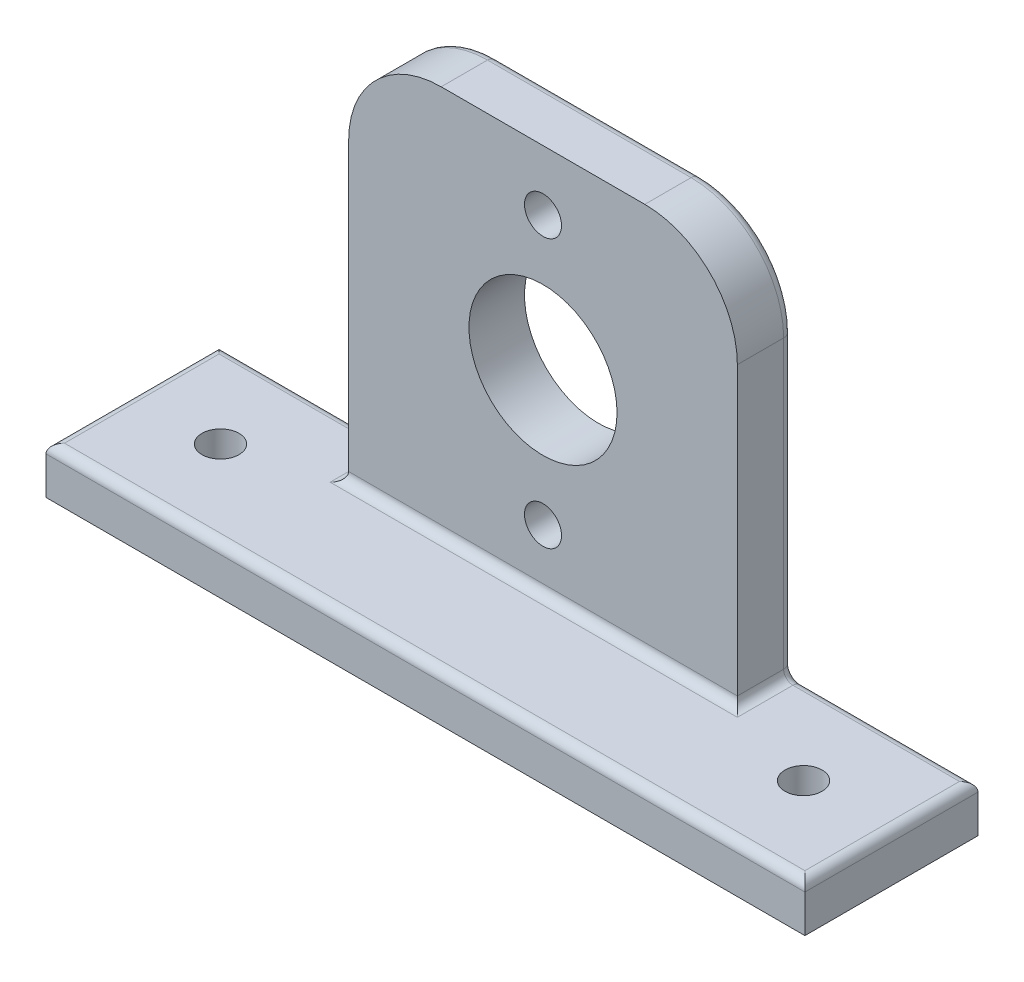
ISO-10303-21;
HEADER;
FILE_DESCRIPTION(('STEP AP214'),'2;1');
FILE_NAME('part.step','',(''),(''),'','','');
FILE_SCHEMA(('AUTOMOTIVE_DESIGN { 1 0 10303 214 1 1 1 1 }'));
ENDSEC;
DATA;
#1=APPLICATION_CONTEXT('core data for automotive mechanical design processes');
#2=APPLICATION_PROTOCOL_DEFINITION('international standard','automotive_design',2000,#1);
#3=PRODUCT_CONTEXT('',#1,'mechanical');
#4=PRODUCT('Part','Part','',(#3));
#5=PRODUCT_RELATED_PRODUCT_CATEGORY('part','',(#4));
#6=PRODUCT_DEFINITION_FORMATION('','',#4);
#7=PRODUCT_DEFINITION_CONTEXT('part definition',#1,'design');
#8=PRODUCT_DEFINITION('design','',#6,#7);
#9=PRODUCT_DEFINITION_SHAPE('','',#8);
#10=(LENGTH_UNIT() NAMED_UNIT(*) SI_UNIT(.MILLI.,.METRE.));
#11=(NAMED_UNIT(*) PLANE_ANGLE_UNIT() SI_UNIT($,.RADIAN.));
#12=(NAMED_UNIT(*) SI_UNIT($,.STERADIAN.) SOLID_ANGLE_UNIT());
#13=UNCERTAINTY_MEASURE_WITH_UNIT(LENGTH_MEASURE(1.E-05),#10,'distance_accuracy_value','');
#14=(GEOMETRIC_REPRESENTATION_CONTEXT(3) GLOBAL_UNCERTAINTY_ASSIGNED_CONTEXT((#13)) GLOBAL_UNIT_ASSIGNED_CONTEXT((#10,
#11,#12)) REPRESENTATION_CONTEXT('',''));
#15=CARTESIAN_POINT('',(0.,0.,0.));
#16=DIRECTION('',(0.,0.,1.));
#17=DIRECTION('',(1.,0.,0.));
#18=AXIS2_PLACEMENT_3D('',#15,#16,#17);
#19=CARTESIAN_POINT('',(0.,0.,6.));
#20=DIRECTION('',(0.,0.,-1.));
#21=DIRECTION('',(-1.,0.,0.));
#22=AXIS2_PLACEMENT_3D('',#19,#20,#21);
#23=PLANE('',#22);
#24=CARTESIAN_POINT('',(41.,26.08,6.));
#25=DIRECTION('',(0.,0.,1.));
#26=DIRECTION('',(1.,0.,0.));
#27=AXIS2_PLACEMENT_3D('',#24,#25,#26);
#28=CIRCLE('',#27,8.);
#29=CARTESIAN_POINT('',(49.,26.08,6.));
#30=VERTEX_POINT('',#29);
#31=EDGE_CURVE('E180',#30,#30,#28,.T.);
#32=ORIENTED_EDGE('',*,*,#31,.F.);
#33=EDGE_LOOP('',(#32));
#34=FACE_BOUND('',#33,.T.);
#35=CARTESIAN_POINT('',(41.,11.58,6.));
#36=DIRECTION('',(0.,0.,1.));
#37=DIRECTION('',(1.,0.,0.));
#38=AXIS2_PLACEMENT_3D('',#35,#36,#37);
#39=CIRCLE('',#38,2.);
#40=CARTESIAN_POINT('',(43.,11.58,6.));
#41=VERTEX_POINT('',#40);
#42=EDGE_CURVE('E187',#41,#41,#39,.T.);
#43=ORIENTED_EDGE('',*,*,#42,.F.);
#44=EDGE_LOOP('',(#43));
#45=FACE_BOUND('',#44,.T.);
#46=CARTESIAN_POINT('',(41.,40.58,6.));
#47=DIRECTION('',(0.,0.,1.));
#48=DIRECTION('',(1.,0.,0.));
#49=AXIS2_PLACEMENT_3D('',#46,#47,#48);
#50=CIRCLE('',#49,2.);
#51=CARTESIAN_POINT('',(43.,40.58,6.));
#52=VERTEX_POINT('',#51);
#53=EDGE_CURVE('E193',#52,#52,#50,.T.);
#54=ORIENTED_EDGE('',*,*,#53,.F.);
#55=EDGE_LOOP('',(#54));
#56=FACE_BOUND('',#55,.T.);
#57=DIRECTION('',(0.,-1.,0.));
#58=VECTOR('',#57,1.);
#59=CARTESIAN_POINT('',(20.,5.08,6.));
#60=LINE('',#59,#58);
#61=CARTESIAN_POINT('',(20.,37.08,6.));
#62=VERTEX_POINT('',#61);
#63=CARTESIAN_POINT('',(20.,6.08,6.));
#64=VERTEX_POINT('',#63);
#65=EDGE_CURVE('E173',#62,#64,#60,.T.);
#66=ORIENTED_EDGE('',*,*,#65,.T.);
#67=DIRECTION('',(-1.,0.,0.));
#68=VECTOR('',#67,1.);
#69=CARTESIAN_POINT('',(62.,6.08,6.));
#70=LINE('',#69,#68);
#71=CARTESIAN_POINT('',(62.,6.08,6.));
#72=VERTEX_POINT('',#71);
#73=EDGE_CURVE('E279',#64,#72,#70,.F.);
#74=ORIENTED_EDGE('',*,*,#73,.T.);
#75=DIRECTION('',(0.,1.,0.));
#76=VECTOR('',#75,1.);
#77=CARTESIAN_POINT('',(62.,47.08,6.));
#78=LINE('',#77,#76);
#79=CARTESIAN_POINT('',(62.,37.08,6.));
#80=VERTEX_POINT('',#79);
#81=EDGE_CURVE('E199',#72,#80,#78,.T.);
#82=ORIENTED_EDGE('',*,*,#81,.T.);
#83=CARTESIAN_POINT('',(52.,37.08,6.));
#84=DIRECTION('',(0.,0.,-1.));
#85=DIRECTION('',(-1.,0.,0.));
#86=AXIS2_PLACEMENT_3D('',#83,#84,#85);
#87=CIRCLE('',#86,10.);
#88=CARTESIAN_POINT('',(52.,47.08,6.));
#89=VERTEX_POINT('',#88);
#90=EDGE_CURVE('E224',#80,#89,#87,.F.);
#91=ORIENTED_EDGE('',*,*,#90,.T.);
#92=DIRECTION('',(-1.,0.,0.));
#93=VECTOR('',#92,1.);
#94=CARTESIAN_POINT('',(20.,47.08,6.));
#95=LINE('',#94,#93);
#96=CARTESIAN_POINT('',(30.,47.08,6.));
#97=VERTEX_POINT('',#96);
#98=EDGE_CURVE('E201',#89,#97,#95,.T.);
#99=ORIENTED_EDGE('',*,*,#98,.T.);
#100=CARTESIAN_POINT('',(30.,37.08,6.));
#101=DIRECTION('',(0.,0.,-1.));
#102=DIRECTION('',(-1.,0.,0.));
#103=AXIS2_PLACEMENT_3D('',#100,#101,#102);
#104=CIRCLE('',#103,10.);
#105=EDGE_CURVE('E216',#97,#62,#104,.F.);
#106=ORIENTED_EDGE('',*,*,#105,.T.);
#107=EDGE_LOOP('',(#66,#74,#82,#91,#99,#106));
#108=FACE_BOUND('',#107,.T.);
#109=ADVANCED_FACE('F33',(#34,#45,#56,#108),#23,.F.);
#110=CARTESIAN_POINT('',(0.,0.,0.));
#111=DIRECTION('',(0.,0.,-1.));
#112=DIRECTION('',(-1.,0.,0.));
#113=AXIS2_PLACEMENT_3D('',#110,#111,#112);
#114=PLANE('',#113);
#115=CARTESIAN_POINT('',(41.,11.58,0.));
#116=DIRECTION('',(0.,0.,1.));
#117=DIRECTION('',(1.,0.,0.));
#118=AXIS2_PLACEMENT_3D('',#115,#116,#117);
#119=CIRCLE('',#118,2.);
#120=CARTESIAN_POINT('',(43.,11.58,0.));
#121=VERTEX_POINT('',#120);
#122=EDGE_CURVE('E185',#121,#121,#119,.T.);
#123=ORIENTED_EDGE('',*,*,#122,.T.);
#124=EDGE_LOOP('',(#123));
#125=FACE_BOUND('',#124,.T.);
#126=CARTESIAN_POINT('',(63.,6.08,0.));
#127=DIRECTION('',(0.,0.,-1.));
#128=DIRECTION('',(-1.,0.,0.));
#129=AXIS2_PLACEMENT_3D('',#126,#127,#128);
#130=CIRCLE('',#129,2.);
#131=CARTESIAN_POINT('',(63.,4.08,0.));
#132=VERTEX_POINT('',#131);
#133=CARTESIAN_POINT('',(61.,6.08,0.));
#134=VERTEX_POINT('',#133);
#135=EDGE_CURVE('E245',#132,#134,#130,.T.);
#136=ORIENTED_EDGE('',*,*,#135,.F.);
#137=DIRECTION('',(-1.,0.,0.));
#138=VECTOR('',#137,1.);
#139=CARTESIAN_POINT('',(82.,4.08,0.));
#140=LINE('',#139,#138);
#141=CARTESIAN_POINT('',(82.,4.07999999999999,0.));
#142=VERTEX_POINT('',#141);
#143=EDGE_CURVE('E248',#132,#142,#140,.F.);
#144=ORIENTED_EDGE('',*,*,#143,.T.);
#145=DIRECTION('',(0.,1.,0.));
#146=VECTOR('',#145,1.);
#147=CARTESIAN_POINT('',(82.,0.,0.));
#148=LINE('',#147,#146);
#149=CARTESIAN_POINT('',(82.,0.,0.));
#150=VERTEX_POINT('',#149);
#151=EDGE_CURVE('E202',#150,#142,#148,.T.);
#152=ORIENTED_EDGE('',*,*,#151,.F.);
#153=DIRECTION('',(1.,0.,0.));
#154=VECTOR('',#153,1.);
#155=CARTESIAN_POINT('',(0.,0.,0.));
#156=LINE('',#155,#154);
#157=CARTESIAN_POINT('',(0.,0.,0.));
#158=VERTEX_POINT('',#157);
#159=EDGE_CURVE('E171',#158,#150,#156,.T.);
#160=ORIENTED_EDGE('',*,*,#159,.F.);
#161=DIRECTION('',(0.,-1.,0.));
#162=VECTOR('',#161,1.);
#163=CARTESIAN_POINT('',(0.,0.,0.));
#164=LINE('',#163,#162);
#165=CARTESIAN_POINT('',(0.,4.08,0.));
#166=VERTEX_POINT('',#165);
#167=EDGE_CURVE('E196',#166,#158,#164,.T.);
#168=ORIENTED_EDGE('',*,*,#167,.F.);
#169=DIRECTION('',(-1.,0.,0.));
#170=VECTOR('',#169,1.);
#171=CARTESIAN_POINT('',(20.,4.08,0.));
#172=LINE('',#171,#170);
#173=CARTESIAN_POINT('',(19.,4.08,0.));
#174=VERTEX_POINT('',#173);
#175=EDGE_CURVE('E232',#166,#174,#172,.F.);
#176=ORIENTED_EDGE('',*,*,#175,.T.);
#177=CARTESIAN_POINT('',(19.,6.08,0.));
#178=DIRECTION('',(0.,0.,-1.));
#179=DIRECTION('',(-1.,0.,0.));
#180=AXIS2_PLACEMENT_3D('',#177,#178,#179);
#181=CIRCLE('',#180,2.);
#182=CARTESIAN_POINT('',(21.,6.08,0.));
#183=VERTEX_POINT('',#182);
#184=EDGE_CURVE('E229',#183,#174,#181,.T.);
#185=ORIENTED_EDGE('',*,*,#184,.F.);
#186=DIRECTION('',(0.,-1.,0.));
#187=VECTOR('',#186,1.);
#188=CARTESIAN_POINT('',(21.,37.08,0.));
#189=LINE('',#188,#187);
#190=CARTESIAN_POINT('',(21.,37.08,0.));
#191=VERTEX_POINT('',#190);
#192=EDGE_CURVE('E234',#183,#191,#189,.F.);
#193=ORIENTED_EDGE('',*,*,#192,.T.);
#194=CARTESIAN_POINT('',(30.,37.08,0.));
#195=DIRECTION('',(0.,0.,-1.));
#196=DIRECTION('',(-1.,0.,0.));
#197=AXIS2_PLACEMENT_3D('',#194,#195,#196);
#198=CIRCLE('',#197,9.);
#199=CARTESIAN_POINT('',(30.,46.08,0.));
#200=VERTEX_POINT('',#199);
#201=EDGE_CURVE('E236',#191,#200,#198,.T.);
#202=ORIENTED_EDGE('',*,*,#201,.T.);
#203=DIRECTION('',(-1.,0.,0.));
#204=VECTOR('',#203,1.);
#205=CARTESIAN_POINT('',(52.,46.08,0.));
#206=LINE('',#205,#204);
#207=CARTESIAN_POINT('',(52.,46.08,0.));
#208=VERTEX_POINT('',#207);
#209=EDGE_CURVE('E238',#200,#208,#206,.F.);
#210=ORIENTED_EDGE('',*,*,#209,.T.);
#211=CARTESIAN_POINT('',(52.,37.08,0.));
#212=DIRECTION('',(0.,0.,-1.));
#213=DIRECTION('',(-1.,0.,0.));
#214=AXIS2_PLACEMENT_3D('',#211,#212,#213);
#215=CIRCLE('',#214,9.);
#216=CARTESIAN_POINT('',(61.,37.08,0.));
#217=VERTEX_POINT('',#216);
#218=EDGE_CURVE('E241',#208,#217,#215,.T.);
#219=ORIENTED_EDGE('',*,*,#218,.T.);
#220=DIRECTION('',(0.,1.,0.));
#221=VECTOR('',#220,1.);
#222=CARTESIAN_POINT('',(61.,5.07999999999999,0.));
#223=LINE('',#222,#221);
#224=EDGE_CURVE('E243',#217,#134,#223,.F.);
#225=ORIENTED_EDGE('',*,*,#224,.T.);
#226=EDGE_LOOP('',(#136,#144,#152,#160,#168,#176,#185,#193,#202,#210,#219,#225));
#227=FACE_BOUND('',#226,.T.);
#228=CARTESIAN_POINT('',(41.,40.58,0.));
#229=DIRECTION('',(0.,0.,1.));
#230=DIRECTION('',(1.,0.,0.));
#231=AXIS2_PLACEMENT_3D('',#228,#229,#230);
#232=CIRCLE('',#231,2.);
#233=CARTESIAN_POINT('',(43.,40.58,0.));
#234=VERTEX_POINT('',#233);
#235=EDGE_CURVE('E190',#234,#234,#232,.T.);
#236=ORIENTED_EDGE('',*,*,#235,.T.);
#237=EDGE_LOOP('',(#236));
#238=FACE_BOUND('',#237,.T.);
#239=CARTESIAN_POINT('',(41.,26.08,0.));
#240=DIRECTION('',(0.,0.,1.));
#241=DIRECTION('',(1.,0.,0.));
#242=AXIS2_PLACEMENT_3D('',#239,#240,#241);
#243=CIRCLE('',#242,8.);
#244=CARTESIAN_POINT('',(49.,26.08,0.));
#245=VERTEX_POINT('',#244);
#246=EDGE_CURVE('E177',#245,#245,#243,.T.);
#247=ORIENTED_EDGE('',*,*,#246,.T.);
#248=EDGE_LOOP('',(#247));
#249=FACE_BOUND('',#248,.T.);
#250=ADVANCED_FACE('F359',(#125,#227,#238,#249),#114,.T.);
#251=CARTESIAN_POINT('',(0.,0.,6.));
#252=DIRECTION('',(1.,0.,0.));
#253=DIRECTION('',(0.,0.,-1.));
#254=AXIS2_PLACEMENT_3D('',#251,#252,#253);
#255=PLANE('',#254);
#256=DIRECTION('',(0.,-1.,0.));
#257=VECTOR('',#256,1.);
#258=CARTESIAN_POINT('',(0.,0.,18.7));
#259=LINE('',#258,#257);
#260=CARTESIAN_POINT('',(0.,4.08,18.7));
#261=VERTEX_POINT('',#260);
#262=CARTESIAN_POINT('',(0.,0.,18.7));
#263=VERTEX_POINT('',#262);
#264=EDGE_CURVE('E164',#261,#263,#259,.T.);
#265=ORIENTED_EDGE('',*,*,#264,.F.);
#266=DIRECTION('',(0.,0.,-1.));
#267=VECTOR('',#266,1.);
#268=CARTESIAN_POINT('',(0.,4.08,6.));
#269=LINE('',#268,#267);
#270=EDGE_CURVE('E11',#261,#166,#269,.T.);
#271=ORIENTED_EDGE('',*,*,#270,.T.);
#272=ORIENTED_EDGE('',*,*,#167,.T.);
#273=DIRECTION('',(0.,0.,-1.));
#274=VECTOR('',#273,1.);
#275=CARTESIAN_POINT('',(0.,0.,6.));
#276=LINE('',#275,#274);
#277=EDGE_CURVE('E172',#263,#158,#276,.T.);
#278=ORIENTED_EDGE('',*,*,#277,.F.);
#279=EDGE_LOOP('',(#265,#271,#272,#278));
#280=FACE_BOUND('',#279,.T.);
#281=ADVANCED_FACE('F365',(#280),#255,.F.);
#282=CARTESIAN_POINT('',(0.,0.,6.));
#283=DIRECTION('',(0.,1.,0.));
#284=DIRECTION('',(0.,0.,1.));
#285=AXIS2_PLACEMENT_3D('',#282,#283,#284);
#286=PLANE('',#285);
#287=CARTESIAN_POINT('',(9.5,0.,9.35));
#288=DIRECTION('',(0.,1.,0.));
#289=DIRECTION('',(0.,0.,1.));
#290=AXIS2_PLACEMENT_3D('',#287,#288,#289);
#291=CIRCLE('',#290,2.);
#292=CARTESIAN_POINT('',(9.5,0.,11.35));
#293=VERTEX_POINT('',#292);
#294=EDGE_CURVE('E329',#293,#293,#291,.T.);
#295=ORIENTED_EDGE('',*,*,#294,.T.);
#296=EDGE_LOOP('',(#295));
#297=FACE_BOUND('',#296,.T.);
#298=CARTESIAN_POINT('',(72.5,0.,9.35));
#299=DIRECTION('',(0.,1.,0.));
#300=DIRECTION('',(0.,0.,1.));
#301=AXIS2_PLACEMENT_3D('',#298,#299,#300);
#302=CIRCLE('',#301,2.);
#303=CARTESIAN_POINT('',(72.5,0.,11.35));
#304=VERTEX_POINT('',#303);
#305=EDGE_CURVE('E334',#304,#304,#302,.T.);
#306=ORIENTED_EDGE('',*,*,#305,.T.);
#307=EDGE_LOOP('',(#306));
#308=FACE_BOUND('',#307,.T.);
#309=ORIENTED_EDGE('',*,*,#159,.T.);
#310=DIRECTION('',(0.,0.,-1.));
#311=VECTOR('',#310,1.);
#312=CARTESIAN_POINT('',(82.,0.,6.));
#313=LINE('',#312,#311);
#314=CARTESIAN_POINT('',(82.,0.,18.7));
#315=VERTEX_POINT('',#314);
#316=EDGE_CURVE('E160',#315,#150,#313,.T.);
#317=ORIENTED_EDGE('',*,*,#316,.F.);
#318=DIRECTION('',(-1.,0.,0.));
#319=VECTOR('',#318,1.);
#320=CARTESIAN_POINT('',(82.,0.,18.7));
#321=LINE('',#320,#319);
#322=EDGE_CURVE('E163',#315,#263,#321,.T.);
#323=ORIENTED_EDGE('',*,*,#322,.T.);
#324=ORIENTED_EDGE('',*,*,#277,.T.);
#325=EDGE_LOOP('',(#309,#317,#323,#324));
#326=FACE_BOUND('',#325,.T.);
#327=ADVANCED_FACE('F168',(#297,#308,#326),#286,.F.);
#328=CARTESIAN_POINT('',(82.,0.,6.));
#329=DIRECTION('',(-1.,0.,0.));
#330=DIRECTION('',(0.,-1.,0.));
#331=AXIS2_PLACEMENT_3D('',#328,#329,#330);
#332=PLANE('',#331);
#333=ORIENTED_EDGE('',*,*,#151,.T.);
#334=DIRECTION('',(0.,0.,-1.));
#335=VECTOR('',#334,1.);
#336=CARTESIAN_POINT('',(82.,4.07999999999999,6.));
#337=LINE('',#336,#335);
#338=CARTESIAN_POINT('',(82.,4.08,18.7));
#339=VERTEX_POINT('',#338);
#340=EDGE_CURVE('E57',#142,#339,#337,.F.);
#341=ORIENTED_EDGE('',*,*,#340,.T.);
#342=DIRECTION('',(0.,-1.,0.));
#343=VECTOR('',#342,1.);
#344=CARTESIAN_POINT('',(82.,0.,18.7));
#345=LINE('',#344,#343);
#346=EDGE_CURVE('E157',#339,#315,#345,.T.);
#347=ORIENTED_EDGE('',*,*,#346,.T.);
#348=ORIENTED_EDGE('',*,*,#316,.T.);
#349=EDGE_LOOP('',(#333,#341,#347,#348));
#350=FACE_BOUND('',#349,.T.);
#351=ADVANCED_FACE('F159',(#350),#332,.F.);
#352=CARTESIAN_POINT('',(62.,47.08,6.));
#353=DIRECTION('',(-1.,0.,0.));
#354=DIRECTION('',(0.,0.,1.));
#355=AXIS2_PLACEMENT_3D('',#352,#353,#354);
#356=PLANE('',#355);
#357=DIRECTION('',(0.,0.,-1.));
#358=VECTOR('',#357,1.);
#359=CARTESIAN_POINT('',(62.,6.08,0.));
#360=LINE('',#359,#358);
#361=CARTESIAN_POINT('',(62.,6.08,1.));
#362=VERTEX_POINT('',#361);
#363=EDGE_CURVE('E258',#72,#362,#360,.T.);
#364=ORIENTED_EDGE('',*,*,#363,.T.);
#365=DIRECTION('',(0.,1.,0.));
#366=VECTOR('',#365,1.);
#367=CARTESIAN_POINT('',(62.,37.08,1.));
#368=LINE('',#367,#366);
#369=CARTESIAN_POINT('',(62.,37.08,1.));
#370=VERTEX_POINT('',#369);
#371=EDGE_CURVE('E260',#362,#370,#368,.T.);
#372=ORIENTED_EDGE('',*,*,#371,.T.);
#373=DIRECTION('',(0.,0.,-1.));
#374=VECTOR('',#373,1.);
#375=CARTESIAN_POINT('',(62.,37.08,6.));
#376=LINE('',#375,#374);
#377=EDGE_CURVE('E221',#370,#80,#376,.F.);
#378=ORIENTED_EDGE('',*,*,#377,.T.);
#379=ORIENTED_EDGE('',*,*,#81,.F.);
#380=EDGE_LOOP('',(#364,#372,#378,#379));
#381=FACE_BOUND('',#380,.T.);
#382=ADVANCED_FACE('F385',(#381),#356,.F.);
#383=CARTESIAN_POINT('',(20.,47.08,6.));
#384=DIRECTION('',(0.,-1.,0.));
#385=DIRECTION('',(0.,0.,-1.));
#386=AXIS2_PLACEMENT_3D('',#383,#384,#385);
#387=PLANE('',#386);
#388=DIRECTION('',(0.,0.,-1.));
#389=VECTOR('',#388,1.);
#390=CARTESIAN_POINT('',(52.,47.08,6.));
#391=LINE('',#390,#389);
#392=CARTESIAN_POINT('',(52.,47.08,1.));
#393=VERTEX_POINT('',#392);
#394=EDGE_CURVE('E218',#89,#393,#391,.T.);
#395=ORIENTED_EDGE('',*,*,#394,.T.);
#396=DIRECTION('',(-1.,0.,0.));
#397=VECTOR('',#396,1.);
#398=CARTESIAN_POINT('',(30.,47.08,1.));
#399=LINE('',#398,#397);
#400=CARTESIAN_POINT('',(30.,47.08,1.));
#401=VERTEX_POINT('',#400);
#402=EDGE_CURVE('E226',#393,#401,#399,.T.);
#403=ORIENTED_EDGE('',*,*,#402,.T.);
#404=DIRECTION('',(0.,0.,-1.));
#405=VECTOR('',#404,1.);
#406=CARTESIAN_POINT('',(30.,47.08,6.));
#407=LINE('',#406,#405);
#408=EDGE_CURVE('E214',#401,#97,#407,.F.);
#409=ORIENTED_EDGE('',*,*,#408,.T.);
#410=ORIENTED_EDGE('',*,*,#98,.F.);
#411=EDGE_LOOP('',(#395,#403,#409,#410));
#412=FACE_BOUND('',#411,.T.);
#413=ADVANCED_FACE('F381',(#412),#387,.F.);
#414=CARTESIAN_POINT('',(20.,5.08,6.));
#415=DIRECTION('',(1.,0.,0.));
#416=DIRECTION('',(0.,0.,-1.));
#417=AXIS2_PLACEMENT_3D('',#414,#415,#416);
#418=PLANE('',#417);
#419=DIRECTION('',(0.,0.,-1.));
#420=VECTOR('',#419,1.);
#421=CARTESIAN_POINT('',(20.,37.08,6.));
#422=LINE('',#421,#420);
#423=CARTESIAN_POINT('',(20.,37.08,1.));
#424=VERTEX_POINT('',#423);
#425=EDGE_CURVE('E211',#62,#424,#422,.T.);
#426=ORIENTED_EDGE('',*,*,#425,.T.);
#427=DIRECTION('',(0.,-1.,0.));
#428=VECTOR('',#427,1.);
#429=CARTESIAN_POINT('',(20.,5.08,1.));
#430=LINE('',#429,#428);
#431=CARTESIAN_POINT('',(20.,6.08,1.));
#432=VERTEX_POINT('',#431);
#433=EDGE_CURVE('E256',#424,#432,#430,.T.);
#434=ORIENTED_EDGE('',*,*,#433,.T.);
#435=DIRECTION('',(0.,0.,-1.));
#436=VECTOR('',#435,1.);
#437=CARTESIAN_POINT('',(20.,6.08,6.));
#438=LINE('',#437,#436);
#439=EDGE_CURVE('E254',#432,#64,#438,.F.);
#440=ORIENTED_EDGE('',*,*,#439,.T.);
#441=ORIENTED_EDGE('',*,*,#65,.F.);
#442=EDGE_LOOP('',(#426,#434,#440,#441));
#443=FACE_BOUND('',#442,.T.);
#444=ADVANCED_FACE('F377',(#443),#418,.F.);
#445=CARTESIAN_POINT('',(0.,5.08,6.));
#446=DIRECTION('',(0.,-1.,0.));
#447=DIRECTION('',(1.,0.,0.));
#448=AXIS2_PLACEMENT_3D('',#445,#446,#447);
#449=PLANE('',#448);
#450=CARTESIAN_POINT('',(9.5,5.08,9.35));
#451=DIRECTION('',(0.,-1.,0.));
#452=DIRECTION('',(1.,0.,0.));
#453=AXIS2_PLACEMENT_3D('',#450,#451,#452);
#454=CIRCLE('',#453,2.);
#455=CARTESIAN_POINT('',(11.5,5.08,9.35));
#456=VERTEX_POINT('',#455);
#457=EDGE_CURVE('E37',#456,#456,#454,.F.);
#458=ORIENTED_EDGE('',*,*,#457,.F.);
#459=EDGE_LOOP('',(#458));
#460=FACE_BOUND('',#459,.T.);
#461=CARTESIAN_POINT('',(72.5,5.08,9.35));
#462=DIRECTION('',(0.,-1.,0.));
#463=DIRECTION('',(1.,0.,0.));
#464=AXIS2_PLACEMENT_3D('',#461,#462,#463);
#465=CIRCLE('',#464,2.);
#466=CARTESIAN_POINT('',(74.5,5.08,9.35));
#467=VERTEX_POINT('',#466);
#468=EDGE_CURVE('E327',#467,#467,#465,.F.);
#469=ORIENTED_EDGE('',*,*,#468,.F.);
#470=EDGE_LOOP('',(#469));
#471=FACE_BOUND('',#470,.T.);
#472=DIRECTION('',(-1.,0.,0.));
#473=VECTOR('',#472,1.);
#474=CARTESIAN_POINT('',(20.,5.08,7.));
#475=LINE('',#474,#473);
#476=CARTESIAN_POINT('',(63.,5.08,7.));
#477=VERTEX_POINT('',#476);
#478=CARTESIAN_POINT('',(19.,5.08,7.));
#479=VERTEX_POINT('',#478);
#480=EDGE_CURVE('E274',#477,#479,#475,.T.);
#481=ORIENTED_EDGE('',*,*,#480,.T.);
#482=DIRECTION('',(0.,0.,-1.));
#483=VECTOR('',#482,1.);
#484=CARTESIAN_POINT('',(19.,5.08,0.));
#485=LINE('',#484,#483);
#486=CARTESIAN_POINT('',(19.,5.08,1.));
#487=VERTEX_POINT('',#486);
#488=EDGE_CURVE('E276',#479,#487,#485,.T.);
#489=ORIENTED_EDGE('',*,*,#488,.T.);
#490=DIRECTION('',(-1.,0.,0.));
#491=VECTOR('',#490,1.);
#492=CARTESIAN_POINT('',(0.,5.08,1.));
#493=LINE('',#492,#491);
#494=CARTESIAN_POINT('',(1.,5.08,1.));
#495=VERTEX_POINT('',#494);
#496=EDGE_CURVE('E262',#487,#495,#493,.T.);
#497=ORIENTED_EDGE('',*,*,#496,.T.);
#498=DIRECTION('',(0.,0.,-1.));
#499=VECTOR('',#498,1.);
#500=CARTESIAN_POINT('',(1.,5.08,6.));
#501=LINE('',#500,#499);
#502=CARTESIAN_POINT('',(1.,5.08,17.7));
#503=VERTEX_POINT('',#502);
#504=EDGE_CURVE('E264',#495,#503,#501,.F.);
#505=ORIENTED_EDGE('',*,*,#504,.T.);
#506=DIRECTION('',(-1.,0.,0.));
#507=VECTOR('',#506,1.);
#508=CARTESIAN_POINT('',(0.,5.08,17.7));
#509=LINE('',#508,#507);
#510=CARTESIAN_POINT('',(81.,5.08,17.7));
#511=VERTEX_POINT('',#510);
#512=EDGE_CURVE('E266',#503,#511,#509,.F.);
#513=ORIENTED_EDGE('',*,*,#512,.T.);
#514=DIRECTION('',(0.,0.,-1.));
#515=VECTOR('',#514,1.);
#516=CARTESIAN_POINT('',(81.,5.08,6.));
#517=LINE('',#516,#515);
#518=CARTESIAN_POINT('',(81.,5.08,1.));
#519=VERTEX_POINT('',#518);
#520=EDGE_CURVE('E268',#511,#519,#517,.T.);
#521=ORIENTED_EDGE('',*,*,#520,.T.);
#522=DIRECTION('',(-1.,0.,0.));
#523=VECTOR('',#522,1.);
#524=CARTESIAN_POINT('',(62.,5.08,1.));
#525=LINE('',#524,#523);
#526=CARTESIAN_POINT('',(63.,5.08,1.));
#527=VERTEX_POINT('',#526);
#528=EDGE_CURVE('E270',#519,#527,#525,.T.);
#529=ORIENTED_EDGE('',*,*,#528,.T.);
#530=DIRECTION('',(0.,0.,-1.));
#531=VECTOR('',#530,1.);
#532=CARTESIAN_POINT('',(63.,5.08,6.));
#533=LINE('',#532,#531);
#534=EDGE_CURVE('E272',#527,#477,#533,.F.);
#535=ORIENTED_EDGE('',*,*,#534,.T.);
#536=EDGE_LOOP('',(#481,#489,#497,#505,#513,#521,#529,#535));
#537=FACE_BOUND('',#536,.T.);
#538=ADVANCED_FACE('F374',(#460,#471,#537),#449,.F.);
#539=CARTESIAN_POINT('',(41.,40.58,6.));
#540=DIRECTION('',(0.,0.,-1.));
#541=DIRECTION('',(-1.,0.,0.));
#542=AXIS2_PLACEMENT_3D('',#539,#540,#541);
#543=CYLINDRICAL_SURFACE('',#542,2.);
#544=ORIENTED_EDGE('',*,*,#53,.T.);
#545=EDGE_LOOP('',(#544));
#546=FACE_BOUND('',#545,.T.);
#547=ORIENTED_EDGE('',*,*,#235,.F.);
#548=EDGE_LOOP('',(#547));
#549=FACE_BOUND('',#548,.T.);
#550=ADVANCED_FACE('F371',(#546,#549),#543,.F.);
#551=CARTESIAN_POINT('',(41.,11.58,6.));
#552=DIRECTION('',(0.,0.,-1.));
#553=DIRECTION('',(-1.,0.,0.));
#554=AXIS2_PLACEMENT_3D('',#551,#552,#553);
#555=CYLINDRICAL_SURFACE('',#554,2.);
#556=ORIENTED_EDGE('',*,*,#42,.T.);
#557=EDGE_LOOP('',(#556));
#558=FACE_BOUND('',#557,.T.);
#559=ORIENTED_EDGE('',*,*,#122,.F.);
#560=EDGE_LOOP('',(#559));
#561=FACE_BOUND('',#560,.T.);
#562=ADVANCED_FACE('F518',(#558,#561),#555,.F.);
#563=CARTESIAN_POINT('',(41.,26.08,6.));
#564=DIRECTION('',(0.,0.,-1.));
#565=DIRECTION('',(-1.,0.,0.));
#566=AXIS2_PLACEMENT_3D('',#563,#564,#565);
#567=CYLINDRICAL_SURFACE('',#566,8.);
#568=ORIENTED_EDGE('',*,*,#31,.T.);
#569=EDGE_LOOP('',(#568));
#570=FACE_BOUND('',#569,.T.);
#571=ORIENTED_EDGE('',*,*,#246,.F.);
#572=EDGE_LOOP('',(#571));
#573=FACE_BOUND('',#572,.T.);
#574=ADVANCED_FACE('F516',(#570,#573),#567,.F.);
#575=CARTESIAN_POINT('',(82.,0.,18.7));
#576=DIRECTION('',(0.,0.,-1.));
#577=DIRECTION('',(-1.,0.,0.));
#578=AXIS2_PLACEMENT_3D('',#575,#576,#577);
#579=PLANE('',#578);
#580=ORIENTED_EDGE('',*,*,#346,.F.);
#581=DIRECTION('',(-1.,0.,0.));
#582=VECTOR('',#581,1.);
#583=CARTESIAN_POINT('',(82.,4.08,18.7));
#584=LINE('',#583,#582);
#585=EDGE_CURVE('E42',#339,#261,#584,.T.);
#586=ORIENTED_EDGE('',*,*,#585,.T.);
#587=ORIENTED_EDGE('',*,*,#264,.T.);
#588=ORIENTED_EDGE('',*,*,#322,.F.);
#589=EDGE_LOOP('',(#580,#586,#587,#588));
#590=FACE_BOUND('',#589,.T.);
#591=ADVANCED_FACE('F175',(#590),#579,.F.);
#592=CARTESIAN_POINT('',(30.,37.08,6.));
#593=DIRECTION('',(0.,0.,-1.));
#594=DIRECTION('',(-1.,0.,0.));
#595=AXIS2_PLACEMENT_3D('',#592,#593,#594);
#596=CYLINDRICAL_SURFACE('',#595,10.);
#597=ORIENTED_EDGE('',*,*,#408,.F.);
#598=CARTESIAN_POINT('',(30.,37.08,1.));
#599=DIRECTION('',(0.,0.,-1.));
#600=DIRECTION('',(-1.,0.,0.));
#601=AXIS2_PLACEMENT_3D('',#598,#599,#600);
#602=CIRCLE('',#601,10.);
#603=EDGE_CURVE('E250',#401,#424,#602,.F.);
#604=ORIENTED_EDGE('',*,*,#603,.T.);
#605=ORIENTED_EDGE('',*,*,#425,.F.);
#606=ORIENTED_EDGE('',*,*,#105,.F.);
#607=EDGE_LOOP('',(#597,#604,#605,#606));
#608=FACE_BOUND('',#607,.T.);
#609=ADVANCED_FACE('F397',(#608),#596,.T.);
#610=CARTESIAN_POINT('',(52.,37.08,6.));
#611=DIRECTION('',(0.,0.,-1.));
#612=DIRECTION('',(-1.,0.,0.));
#613=AXIS2_PLACEMENT_3D('',#610,#611,#612);
#614=CYLINDRICAL_SURFACE('',#613,10.);
#615=ORIENTED_EDGE('',*,*,#377,.F.);
#616=CARTESIAN_POINT('',(52.,37.08,1.));
#617=DIRECTION('',(0.,0.,-1.));
#618=DIRECTION('',(-1.,0.,0.));
#619=AXIS2_PLACEMENT_3D('',#616,#617,#618);
#620=CIRCLE('',#619,10.);
#621=EDGE_CURVE('E252',#370,#393,#620,.F.);
#622=ORIENTED_EDGE('',*,*,#621,.T.);
#623=ORIENTED_EDGE('',*,*,#394,.F.);
#624=ORIENTED_EDGE('',*,*,#90,.F.);
#625=EDGE_LOOP('',(#615,#622,#623,#624));
#626=FACE_BOUND('',#625,.T.);
#627=ADVANCED_FACE('F400',(#626),#614,.T.);
#628=CARTESIAN_POINT('',(82.,4.08,17.7));
#629=DIRECTION('',(-1.,0.,0.));
#630=DIRECTION('',(0.,-1.,0.));
#631=AXIS2_PLACEMENT_3D('',#628,#629,#630);
#632=CYLINDRICAL_SURFACE('',#631,1.);
#633=CARTESIAN_POINT('',(1.,4.08,17.7));
#634=DIRECTION('',(-0.707106781186547,0.,-0.707106781186547));
#635=DIRECTION('',(0.707106781186547,0.,-0.707106781186547));
#636=AXIS2_PLACEMENT_3D('',#633,#634,#635);
#637=ELLIPSE('',#636,1.41421356237309,1.);
#638=EDGE_CURVE('E322',#261,#503,#637,.T.);
#639=ORIENTED_EDGE('',*,*,#638,.F.);
#640=ORIENTED_EDGE('',*,*,#585,.F.);
#641=CARTESIAN_POINT('',(81.,4.08,17.7));
#642=DIRECTION('',(-0.707106781186547,0.,0.707106781186547));
#643=DIRECTION('',(-0.707106781186547,0.,-0.707106781186547));
#644=AXIS2_PLACEMENT_3D('',#641,#642,#643);
#645=ELLIPSE('',#644,1.41421356237309,1.);
#646=EDGE_CURVE('E325',#511,#339,#645,.F.);
#647=ORIENTED_EDGE('',*,*,#646,.F.);
#648=ORIENTED_EDGE('',*,*,#512,.F.);
#649=EDGE_LOOP('',(#639,#640,#647,#648));
#650=FACE_BOUND('',#649,.T.);
#651=ADVANCED_FACE('F35',(#650),#632,.T.);
#652=CARTESIAN_POINT('',(81.,4.08,6.));
#653=DIRECTION('',(0.,0.,-1.));
#654=DIRECTION('',(-1.,0.,0.));
#655=AXIS2_PLACEMENT_3D('',#652,#653,#654);
#656=CYLINDRICAL_SURFACE('',#655,1.);
#657=ORIENTED_EDGE('',*,*,#646,.T.);
#658=ORIENTED_EDGE('',*,*,#340,.F.);
#659=CARTESIAN_POINT('',(81.,4.08,1.));
#660=DIRECTION('',(-0.707106781186547,0.,-0.707106781186547));
#661=DIRECTION('',(0.707106781186547,0.,-0.707106781186547));
#662=AXIS2_PLACEMENT_3D('',#659,#660,#661);
#663=ELLIPSE('',#662,1.41421356237309,1.);
#664=EDGE_CURVE('E319',#519,#142,#663,.T.);
#665=ORIENTED_EDGE('',*,*,#664,.F.);
#666=ORIENTED_EDGE('',*,*,#520,.F.);
#667=EDGE_LOOP('',(#657,#658,#665,#666));
#668=FACE_BOUND('',#667,.T.);
#669=ADVANCED_FACE('F450',(#668),#656,.T.);
#670=CARTESIAN_POINT('',(0.,6.08,7.));
#671=DIRECTION('',(1.,0.,0.));
#672=DIRECTION('',(0.,1.,0.));
#673=AXIS2_PLACEMENT_3D('',#670,#671,#672);
#674=CYLINDRICAL_SURFACE('',#673,1.);
#675=CARTESIAN_POINT('',(19.,6.08,7.));
#676=DIRECTION('',(0.707106781186547,0.,0.707106781186547));
#677=DIRECTION('',(0.707106781186547,0.,-0.707106781186547));
#678=AXIS2_PLACEMENT_3D('',#675,#676,#677);
#679=ELLIPSE('',#678,1.41421356237309,1.);
#680=EDGE_CURVE('E313',#479,#64,#679,.T.);
#681=ORIENTED_EDGE('',*,*,#680,.F.);
#682=ORIENTED_EDGE('',*,*,#480,.F.);
#683=CARTESIAN_POINT('',(63.,6.08,7.));
#684=DIRECTION('',(-0.707106781186547,0.,0.707106781186547));
#685=DIRECTION('',(0.707106781186547,0.,0.707106781186547));
#686=AXIS2_PLACEMENT_3D('',#683,#684,#685);
#687=ELLIPSE('',#686,1.41421356237309,1.);
#688=EDGE_CURVE('E316',#72,#477,#687,.T.);
#689=ORIENTED_EDGE('',*,*,#688,.F.);
#690=ORIENTED_EDGE('',*,*,#73,.F.);
#691=EDGE_LOOP('',(#681,#682,#689,#690));
#692=FACE_BOUND('',#691,.T.);
#693=ADVANCED_FACE('F447',(#692),#674,.F.);
#694=CARTESIAN_POINT('',(1.,4.08,6.));
#695=DIRECTION('',(0.,0.,-1.));
#696=DIRECTION('',(-1.,0.,0.));
#697=AXIS2_PLACEMENT_3D('',#694,#695,#696);
#698=CYLINDRICAL_SURFACE('',#697,1.);
#699=ORIENTED_EDGE('',*,*,#638,.T.);
#700=ORIENTED_EDGE('',*,*,#504,.F.);
#701=CARTESIAN_POINT('',(1.,4.08,1.));
#702=DIRECTION('',(0.707106781186547,0.,-0.707106781186547));
#703=DIRECTION('',(0.707106781186547,0.,0.707106781186547));
#704=AXIS2_PLACEMENT_3D('',#701,#702,#703);
#705=ELLIPSE('',#704,1.41421356237309,1.);
#706=EDGE_CURVE('E310',#166,#495,#705,.T.);
#707=ORIENTED_EDGE('',*,*,#706,.F.);
#708=ORIENTED_EDGE('',*,*,#270,.F.);
#709=EDGE_LOOP('',(#699,#700,#707,#708));
#710=FACE_BOUND('',#709,.T.);
#711=ADVANCED_FACE('F443',(#710),#698,.T.);
#712=CARTESIAN_POINT('',(0.,4.08,1.));
#713=DIRECTION('',(1.,0.,0.));
#714=DIRECTION('',(0.,1.,0.));
#715=AXIS2_PLACEMENT_3D('',#712,#713,#714);
#716=CYLINDRICAL_SURFACE('',#715,1.);
#717=ORIENTED_EDGE('',*,*,#664,.T.);
#718=ORIENTED_EDGE('',*,*,#143,.F.);
#719=CARTESIAN_POINT('',(63.,4.08,1.));
#720=DIRECTION('',(-1.,0.,0.));
#721=DIRECTION('',(0.,0.,1.));
#722=AXIS2_PLACEMENT_3D('',#719,#720,#721);
#723=CIRCLE('',#722,1.);
#724=EDGE_CURVE('E307',#527,#132,#723,.T.);
#725=ORIENTED_EDGE('',*,*,#724,.F.);
#726=ORIENTED_EDGE('',*,*,#528,.F.);
#727=EDGE_LOOP('',(#717,#718,#725,#726));
#728=FACE_BOUND('',#727,.T.);
#729=ADVANCED_FACE('F439',(#728),#716,.T.);
#730=CARTESIAN_POINT('',(63.,6.08,6.));
#731=DIRECTION('',(0.,0.,1.));
#732=DIRECTION('',(1.,0.,0.));
#733=AXIS2_PLACEMENT_3D('',#730,#731,#732);
#734=CYLINDRICAL_SURFACE('',#733,1.);
#735=ORIENTED_EDGE('',*,*,#688,.T.);
#736=ORIENTED_EDGE('',*,*,#534,.F.);
#737=CARTESIAN_POINT('',(63.,6.08,1.));
#738=DIRECTION('',(0.,0.,-1.));
#739=DIRECTION('',(-1.,0.,0.));
#740=AXIS2_PLACEMENT_3D('',#737,#738,#739);
#741=CIRCLE('',#740,1.);
#742=EDGE_CURVE('E304',#362,#527,#741,.F.);
#743=ORIENTED_EDGE('',*,*,#742,.F.);
#744=ORIENTED_EDGE('',*,*,#363,.F.);
#745=EDGE_LOOP('',(#735,#736,#743,#744));
#746=FACE_BOUND('',#745,.T.);
#747=ADVANCED_FACE('F435',(#746),#734,.F.);
#748=CARTESIAN_POINT('',(19.,6.08,6.));
#749=DIRECTION('',(0.,0.,1.));
#750=DIRECTION('',(1.,0.,0.));
#751=AXIS2_PLACEMENT_3D('',#748,#749,#750);
#752=CYLINDRICAL_SURFACE('',#751,1.);
#753=ORIENTED_EDGE('',*,*,#680,.T.);
#754=ORIENTED_EDGE('',*,*,#439,.F.);
#755=CARTESIAN_POINT('',(19.,6.08,1.));
#756=DIRECTION('',(0.,0.,-1.));
#757=DIRECTION('',(-1.,0.,0.));
#758=AXIS2_PLACEMENT_3D('',#755,#756,#757);
#759=CIRCLE('',#758,1.);
#760=EDGE_CURVE('E301',#487,#432,#759,.F.);
#761=ORIENTED_EDGE('',*,*,#760,.F.);
#762=ORIENTED_EDGE('',*,*,#488,.F.);
#763=EDGE_LOOP('',(#753,#754,#761,#762));
#764=FACE_BOUND('',#763,.T.);
#765=ADVANCED_FACE('F431',(#764),#752,.F.);
#766=CARTESIAN_POINT('',(0.,4.08,1.));
#767=DIRECTION('',(1.,0.,0.));
#768=DIRECTION('',(0.,1.,0.));
#769=AXIS2_PLACEMENT_3D('',#766,#767,#768);
#770=CYLINDRICAL_SURFACE('',#769,1.);
#771=ORIENTED_EDGE('',*,*,#706,.T.);
#772=ORIENTED_EDGE('',*,*,#496,.F.);
#773=CARTESIAN_POINT('',(19.,4.08,1.));
#774=DIRECTION('',(1.,0.,0.));
#775=DIRECTION('',(0.,0.,-1.));
#776=AXIS2_PLACEMENT_3D('',#773,#774,#775);
#777=CIRCLE('',#776,1.);
#778=EDGE_CURVE('E299',#174,#487,#777,.T.);
#779=ORIENTED_EDGE('',*,*,#778,.F.);
#780=ORIENTED_EDGE('',*,*,#175,.F.);
#781=EDGE_LOOP('',(#771,#772,#779,#780));
#782=FACE_BOUND('',#781,.T.);
#783=ADVANCED_FACE('F427',(#782),#770,.T.);
#784=CARTESIAN_POINT('',(63.,6.08,1.));
#785=DIRECTION('',(0.,0.,-1.));
#786=DIRECTION('',(-1.,0.,0.));
#787=AXIS2_PLACEMENT_3D('',#784,#785,#786);
#788=TOROIDAL_SURFACE('',#787,2.,1.);
#789=ORIENTED_EDGE('',*,*,#724,.T.);
#790=ORIENTED_EDGE('',*,*,#135,.T.);
#791=CARTESIAN_POINT('',(61.,6.08,1.));
#792=DIRECTION('',(0.,-1.,0.));
#793=DIRECTION('',(0.,0.,-1.));
#794=AXIS2_PLACEMENT_3D('',#791,#792,#793);
#795=CIRCLE('',#794,1.);
#796=EDGE_CURVE('E296',#362,#134,#795,.F.);
#797=ORIENTED_EDGE('',*,*,#796,.F.);
#798=ORIENTED_EDGE('',*,*,#742,.T.);
#799=EDGE_LOOP('',(#789,#790,#797,#798));
#800=FACE_BOUND('',#799,.T.);
#801=ADVANCED_FACE('F423',(#800),#788,.T.);
#802=CARTESIAN_POINT('',(19.,6.08,1.));
#803=DIRECTION('',(0.,0.,-1.));
#804=DIRECTION('',(-1.,0.,0.));
#805=AXIS2_PLACEMENT_3D('',#802,#803,#804);
#806=TOROIDAL_SURFACE('',#805,2.,1.);
#807=ORIENTED_EDGE('',*,*,#778,.T.);
#808=ORIENTED_EDGE('',*,*,#760,.T.);
#809=CARTESIAN_POINT('',(21.,6.08,1.));
#810=DIRECTION('',(0.,-1.,0.));
#811=DIRECTION('',(0.,0.,-1.));
#812=AXIS2_PLACEMENT_3D('',#809,#810,#811);
#813=CIRCLE('',#812,1.);
#814=EDGE_CURVE('E293',#183,#432,#813,.F.);
#815=ORIENTED_EDGE('',*,*,#814,.F.);
#816=ORIENTED_EDGE('',*,*,#184,.T.);
#817=EDGE_LOOP('',(#807,#808,#815,#816));
#818=FACE_BOUND('',#817,.T.);
#819=ADVANCED_FACE('F419',(#818),#806,.T.);
#820=CARTESIAN_POINT('',(61.,47.08,1.));
#821=DIRECTION('',(0.,-1.,0.));
#822=DIRECTION('',(0.,0.,-1.));
#823=AXIS2_PLACEMENT_3D('',#820,#821,#822);
#824=CYLINDRICAL_SURFACE('',#823,1.);
#825=ORIENTED_EDGE('',*,*,#796,.T.);
#826=ORIENTED_EDGE('',*,*,#224,.F.);
#827=CARTESIAN_POINT('',(61.,37.08,1.));
#828=DIRECTION('',(0.,1.,0.));
#829=DIRECTION('',(0.,0.,1.));
#830=AXIS2_PLACEMENT_3D('',#827,#828,#829);
#831=CIRCLE('',#830,1.);
#832=EDGE_CURVE('E290',#370,#217,#831,.T.);
#833=ORIENTED_EDGE('',*,*,#832,.F.);
#834=ORIENTED_EDGE('',*,*,#371,.F.);
#835=EDGE_LOOP('',(#825,#826,#833,#834));
#836=FACE_BOUND('',#835,.T.);
#837=ADVANCED_FACE('F415',(#836),#824,.T.);
#838=CARTESIAN_POINT('',(21.,5.08,1.));
#839=DIRECTION('',(0.,1.,0.));
#840=DIRECTION('',(0.,0.,1.));
#841=AXIS2_PLACEMENT_3D('',#838,#839,#840);
#842=CYLINDRICAL_SURFACE('',#841,1.);
#843=ORIENTED_EDGE('',*,*,#814,.T.);
#844=ORIENTED_EDGE('',*,*,#433,.F.);
#845=CARTESIAN_POINT('',(21.,37.08,1.));
#846=DIRECTION('',(0.,1.,0.));
#847=DIRECTION('',(0.,0.,1.));
#848=AXIS2_PLACEMENT_3D('',#845,#846,#847);
#849=CIRCLE('',#848,1.);
#850=EDGE_CURVE('E287',#191,#424,#849,.T.);
#851=ORIENTED_EDGE('',*,*,#850,.F.);
#852=ORIENTED_EDGE('',*,*,#192,.F.);
#853=EDGE_LOOP('',(#843,#844,#851,#852));
#854=FACE_BOUND('',#853,.T.);
#855=ADVANCED_FACE('F411',(#854),#842,.T.);
#856=CARTESIAN_POINT('',(52.,37.08,1.));
#857=DIRECTION('',(0.,0.,-1.));
#858=DIRECTION('',(-1.,0.,0.));
#859=AXIS2_PLACEMENT_3D('',#856,#857,#858);
#860=TOROIDAL_SURFACE('',#859,9.,1.);
#861=ORIENTED_EDGE('',*,*,#832,.T.);
#862=ORIENTED_EDGE('',*,*,#218,.F.);
#863=CARTESIAN_POINT('',(52.,46.08,1.));
#864=DIRECTION('',(-1.,0.,0.));
#865=DIRECTION('',(0.,0.,1.));
#866=AXIS2_PLACEMENT_3D('',#863,#864,#865);
#867=CIRCLE('',#866,1.);
#868=EDGE_CURVE('E285',#393,#208,#867,.T.);
#869=ORIENTED_EDGE('',*,*,#868,.F.);
#870=ORIENTED_EDGE('',*,*,#621,.F.);
#871=EDGE_LOOP('',(#861,#862,#869,#870));
#872=FACE_BOUND('',#871,.T.);
#873=ADVANCED_FACE('F407',(#872),#860,.T.);
#874=CARTESIAN_POINT('',(30.,37.08,1.));
#875=DIRECTION('',(0.,0.,-1.));
#876=DIRECTION('',(-1.,0.,0.));
#877=AXIS2_PLACEMENT_3D('',#874,#875,#876);
#878=TOROIDAL_SURFACE('',#877,9.,1.);
#879=ORIENTED_EDGE('',*,*,#850,.T.);
#880=ORIENTED_EDGE('',*,*,#603,.F.);
#881=CARTESIAN_POINT('',(30.,46.08,1.));
#882=DIRECTION('',(1.,0.,0.));
#883=DIRECTION('',(0.,0.,-1.));
#884=AXIS2_PLACEMENT_3D('',#881,#882,#883);
#885=CIRCLE('',#884,1.);
#886=EDGE_CURVE('E283',#200,#401,#885,.T.);
#887=ORIENTED_EDGE('',*,*,#886,.F.);
#888=ORIENTED_EDGE('',*,*,#201,.F.);
#889=EDGE_LOOP('',(#879,#880,#887,#888));
#890=FACE_BOUND('',#889,.T.);
#891=ADVANCED_FACE('F354',(#890),#878,.T.);
#892=CARTESIAN_POINT('',(20.,46.08,1.));
#893=DIRECTION('',(1.,0.,0.));
#894=DIRECTION('',(0.,0.,-1.));
#895=AXIS2_PLACEMENT_3D('',#892,#893,#894);
#896=CYLINDRICAL_SURFACE('',#895,1.);
#897=ORIENTED_EDGE('',*,*,#868,.T.);
#898=ORIENTED_EDGE('',*,*,#209,.F.);
#899=ORIENTED_EDGE('',*,*,#886,.T.);
#900=ORIENTED_EDGE('',*,*,#402,.F.);
#901=EDGE_LOOP('',(#897,#898,#899,#900));
#902=FACE_BOUND('',#901,.T.);
#903=ADVANCED_FACE('F346',(#902),#896,.T.);
#904=CARTESIAN_POINT('',(72.5,6.,9.35));
#905=DIRECTION('',(0.,-1.,0.));
#906=DIRECTION('',(0.,0.,-1.));
#907=AXIS2_PLACEMENT_3D('',#904,#905,#906);
#908=CYLINDRICAL_SURFACE('',#907,2.);
#909=ORIENTED_EDGE('',*,*,#305,.F.);
#910=EDGE_LOOP('',(#909));
#911=FACE_BOUND('',#910,.T.);
#912=ORIENTED_EDGE('',*,*,#468,.T.);
#913=EDGE_LOOP('',(#912));
#914=FACE_BOUND('',#913,.T.);
#915=ADVANCED_FACE('F343',(#911,#914),#908,.F.);
#916=CARTESIAN_POINT('',(9.5,6.,9.35));
#917=DIRECTION('',(0.,-1.,0.));
#918=DIRECTION('',(0.,0.,-1.));
#919=AXIS2_PLACEMENT_3D('',#916,#917,#918);
#920=CYLINDRICAL_SURFACE('',#919,2.);
#921=ORIENTED_EDGE('',*,*,#294,.F.);
#922=EDGE_LOOP('',(#921));
#923=FACE_BOUND('',#922,.T.);
#924=ORIENTED_EDGE('',*,*,#457,.T.);
#925=EDGE_LOOP('',(#924));
#926=FACE_BOUND('',#925,.T.);
#927=ADVANCED_FACE('F345',(#923,#926),#920,.F.);
#928=CLOSED_SHELL('',(#109,#250,#281,#327,#351,#382,#413,#444,#538,#550,#562,#574,#591,#609,
#627,#651,#669,#693,#711,#729,#747,#765,#783,#801,#819,#837,#855,#873,#891,#903,#915,#927));
#929=MANIFOLD_SOLID_BREP('B2',#928);
#930=ADVANCED_BREP_SHAPE_REPRESENTATION('',(#18,#929),#14);
#931=SHAPE_DEFINITION_REPRESENTATION(#9,#930);
ENDSEC;
END-ISO-10303-21;
